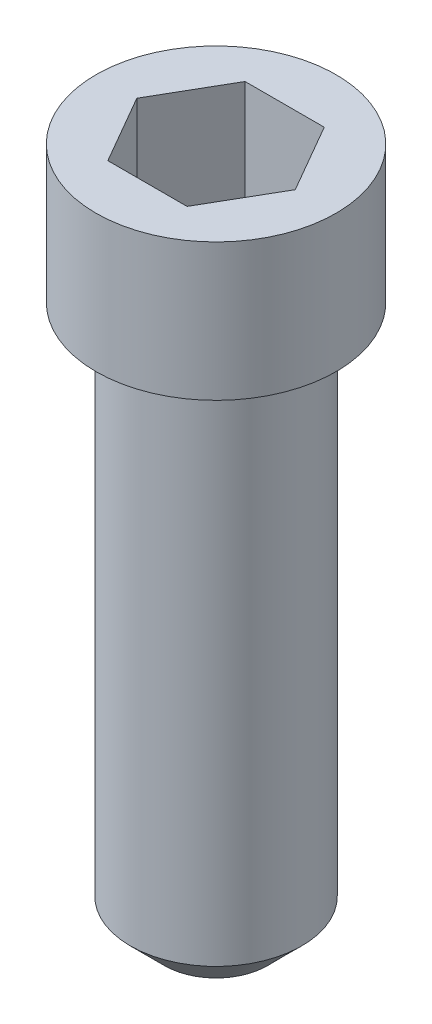
ISO-10303-21;
HEADER;
FILE_DESCRIPTION(('STEP AP214'),'2;1');
FILE_NAME('part.step','',(''),(''),'','','');
FILE_SCHEMA(('AUTOMOTIVE_DESIGN { 1 0 10303 214 1 1 1 1 }'));
ENDSEC;
DATA;
#1=APPLICATION_CONTEXT('core data for automotive mechanical design processes');
#2=APPLICATION_PROTOCOL_DEFINITION('international standard','automotive_design',2000,#1);
#3=PRODUCT_CONTEXT('',#1,'mechanical');
#4=PRODUCT('Part','Part','',(#3));
#5=PRODUCT_RELATED_PRODUCT_CATEGORY('part','',(#4));
#6=PRODUCT_DEFINITION_FORMATION('','',#4);
#7=PRODUCT_DEFINITION_CONTEXT('part definition',#1,'design');
#8=PRODUCT_DEFINITION('design','',#6,#7);
#9=PRODUCT_DEFINITION_SHAPE('','',#8);
#10=(LENGTH_UNIT() NAMED_UNIT(*) SI_UNIT(.MILLI.,.METRE.));
#11=(NAMED_UNIT(*) PLANE_ANGLE_UNIT() SI_UNIT($,.RADIAN.));
#12=(NAMED_UNIT(*) SI_UNIT($,.STERADIAN.) SOLID_ANGLE_UNIT());
#13=UNCERTAINTY_MEASURE_WITH_UNIT(LENGTH_MEASURE(1.E-05),#10,'distance_accuracy_value','');
#14=(GEOMETRIC_REPRESENTATION_CONTEXT(3) GLOBAL_UNCERTAINTY_ASSIGNED_CONTEXT((#13)) GLOBAL_UNIT_ASSIGNED_CONTEXT((#10,
#11,#12)) REPRESENTATION_CONTEXT('',''));
#15=CARTESIAN_POINT('',(0.,0.,0.));
#16=DIRECTION('',(0.,0.,1.));
#17=DIRECTION('',(1.,0.,0.));
#18=AXIS2_PLACEMENT_3D('',#15,#16,#17);
#19=CARTESIAN_POINT('',(0.,16.,0.));
#20=DIRECTION('',(0.,-1.,0.));
#21=DIRECTION('',(0.,0.,-1.));
#22=AXIS2_PLACEMENT_3D('',#19,#20,#21);
#23=CYLINDRICAL_SURFACE('',#22,2.5);
#24=CARTESIAN_POINT('',(0.,0.999999999999999,0.));
#25=DIRECTION('',(0.,1.,0.));
#26=DIRECTION('',(0.,0.,1.));
#27=AXIS2_PLACEMENT_3D('',#24,#25,#26);
#28=CIRCLE('',#27,2.5);
#29=CARTESIAN_POINT('',(0.,0.999999999999999,2.5));
#30=VERTEX_POINT('',#29);
#31=EDGE_CURVE('E39',#30,#30,#28,.T.);
#32=ORIENTED_EDGE('',*,*,#31,.T.);
#33=EDGE_LOOP('',(#32));
#34=FACE_BOUND('',#33,.T.);
#35=CARTESIAN_POINT('',(0.,16.,0.));
#36=DIRECTION('',(0.,1.,0.));
#37=DIRECTION('',(0.,0.,1.));
#38=AXIS2_PLACEMENT_3D('',#35,#36,#37);
#39=CIRCLE('',#38,2.5);
#40=CARTESIAN_POINT('',(0.,16.,2.5));
#41=VERTEX_POINT('',#40);
#42=EDGE_CURVE('E142',#41,#41,#39,.T.);
#43=ORIENTED_EDGE('',*,*,#42,.F.);
#44=EDGE_LOOP('',(#43));
#45=FACE_BOUND('',#44,.T.);
#46=ADVANCED_FACE('F31',(#34,#45),#23,.T.);
#47=CARTESIAN_POINT('',(0.,0.,0.));
#48=DIRECTION('',(0.,1.,0.));
#49=DIRECTION('',(0.,0.,1.));
#50=AXIS2_PLACEMENT_3D('',#47,#48,#49);
#51=PLANE('',#50);
#52=CARTESIAN_POINT('',(0.,0.,0.));
#53=DIRECTION('',(0.,1.,0.));
#54=DIRECTION('',(0.,0.,1.));
#55=AXIS2_PLACEMENT_3D('',#52,#53,#54);
#56=CIRCLE('',#55,1.5);
#57=CARTESIAN_POINT('',(0.,0.,1.5));
#58=VERTEX_POINT('',#57);
#59=EDGE_CURVE('E11',#58,#58,#56,.F.);
#60=ORIENTED_EDGE('',*,*,#59,.T.);
#61=EDGE_LOOP('',(#60));
#62=FACE_BOUND('',#61,.T.);
#63=ADVANCED_FACE('F166',(#62),#51,.F.);
#64=CARTESIAN_POINT('',(0.,16.,0.));
#65=DIRECTION('',(0.,1.,0.));
#66=DIRECTION('',(0.,0.,1.));
#67=AXIS2_PLACEMENT_3D('',#64,#65,#66);
#68=PLANE('',#67);
#69=CARTESIAN_POINT('',(0.,16.,0.));
#70=DIRECTION('',(0.,1.,0.));
#71=DIRECTION('',(0.,0.,1.));
#72=AXIS2_PLACEMENT_3D('',#69,#70,#71);
#73=CIRCLE('',#72,3.5);
#74=CARTESIAN_POINT('',(0.,16.,3.5));
#75=VERTEX_POINT('',#74);
#76=EDGE_CURVE('E133',#75,#75,#73,.T.);
#77=ORIENTED_EDGE('',*,*,#76,.F.);
#78=EDGE_LOOP('',(#77));
#79=FACE_BOUND('',#78,.T.);
#80=ORIENTED_EDGE('',*,*,#42,.T.);
#81=EDGE_LOOP('',(#80));
#82=FACE_BOUND('',#81,.T.);
#83=ADVANCED_FACE('F170',(#79,#82),#68,.F.);
#84=CARTESIAN_POINT('',(0.,20.,0.));
#85=DIRECTION('',(0.,-1.,0.));
#86=DIRECTION('',(0.,0.,-1.));
#87=AXIS2_PLACEMENT_3D('',#84,#85,#86);
#88=CYLINDRICAL_SURFACE('',#87,3.5);
#89=CARTESIAN_POINT('',(0.,20.,0.));
#90=DIRECTION('',(0.,1.,0.));
#91=DIRECTION('',(0.,0.,1.));
#92=AXIS2_PLACEMENT_3D('',#89,#90,#91);
#93=CIRCLE('',#92,3.5);
#94=CARTESIAN_POINT('',(0.,20.,3.5));
#95=VERTEX_POINT('',#94);
#96=EDGE_CURVE('E139',#95,#95,#93,.T.);
#97=ORIENTED_EDGE('',*,*,#96,.F.);
#98=EDGE_LOOP('',(#97));
#99=FACE_BOUND('',#98,.T.);
#100=ORIENTED_EDGE('',*,*,#76,.T.);
#101=EDGE_LOOP('',(#100));
#102=FACE_BOUND('',#101,.T.);
#103=ADVANCED_FACE('F161',(#99,#102),#88,.T.);
#104=CARTESIAN_POINT('',(0.,20.,0.));
#105=DIRECTION('',(0.,1.,0.));
#106=DIRECTION('',(0.,0.,1.));
#107=AXIS2_PLACEMENT_3D('',#104,#105,#106);
#108=PLANE('',#107);
#109=DIRECTION('',(0.5,0.,-0.866025403784438));
#110=VECTOR('',#109,1.);
#111=CARTESIAN_POINT('',(1.15470053837925,20.,2.));
#112=LINE('',#111,#110);
#113=CARTESIAN_POINT('',(1.15470053837925,20.,2.));
#114=VERTEX_POINT('',#113);
#115=CARTESIAN_POINT('',(2.3094010767585,20.,0.));
#116=VERTEX_POINT('',#115);
#117=EDGE_CURVE('E46',#114,#116,#112,.T.);
#118=ORIENTED_EDGE('',*,*,#117,.F.);
#119=DIRECTION('',(1.,0.,0.));
#120=VECTOR('',#119,1.);
#121=CARTESIAN_POINT('',(-1.15470053837925,20.,2.));
#122=LINE('',#121,#120);
#123=CARTESIAN_POINT('',(-1.15470053837925,20.,2.));
#124=VERTEX_POINT('',#123);
#125=EDGE_CURVE('E129',#124,#114,#122,.T.);
#126=ORIENTED_EDGE('',*,*,#125,.F.);
#127=DIRECTION('',(0.5,0.,0.866025403784439));
#128=VECTOR('',#127,1.);
#129=CARTESIAN_POINT('',(-2.3094010767585,20.,0.));
#130=LINE('',#129,#128);
#131=CARTESIAN_POINT('',(-2.3094010767585,20.,0.));
#132=VERTEX_POINT('',#131);
#133=EDGE_CURVE('E127',#132,#124,#130,.T.);
#134=ORIENTED_EDGE('',*,*,#133,.F.);
#135=DIRECTION('',(-0.5,0.,0.866025403784439));
#136=VECTOR('',#135,1.);
#137=CARTESIAN_POINT('',(-1.15470053837925,20.,-2.));
#138=LINE('',#137,#136);
#139=CARTESIAN_POINT('',(-1.15470053837925,20.,-2.));
#140=VERTEX_POINT('',#139);
#141=EDGE_CURVE('E94',#140,#132,#138,.T.);
#142=ORIENTED_EDGE('',*,*,#141,.F.);
#143=DIRECTION('',(-1.,0.,0.));
#144=VECTOR('',#143,1.);
#145=CARTESIAN_POINT('',(1.15470053837925,20.,-2.));
#146=LINE('',#145,#144);
#147=CARTESIAN_POINT('',(1.15470053837925,20.,-2.));
#148=VERTEX_POINT('',#147);
#149=EDGE_CURVE('E123',#148,#140,#146,.T.);
#150=ORIENTED_EDGE('',*,*,#149,.F.);
#151=DIRECTION('',(-0.5,0.,-0.866025403784438));
#152=VECTOR('',#151,1.);
#153=CARTESIAN_POINT('',(2.3094010767585,20.,0.));
#154=LINE('',#153,#152);
#155=EDGE_CURVE('E120',#116,#148,#154,.T.);
#156=ORIENTED_EDGE('',*,*,#155,.F.);
#157=EDGE_LOOP('',(#118,#126,#134,#142,#150,#156));
#158=FACE_BOUND('',#157,.T.);
#159=ORIENTED_EDGE('',*,*,#96,.T.);
#160=EDGE_LOOP('',(#159));
#161=FACE_BOUND('',#160,.T.);
#162=ADVANCED_FACE('F153',(#158,#161),#108,.T.);
#163=CARTESIAN_POINT('',(0.,0.999999999999999,0.));
#164=DIRECTION('',(0.,1.,0.));
#165=DIRECTION('',(0.,0.,1.));
#166=AXIS2_PLACEMENT_3D('',#163,#164,#165);
#167=CONICAL_SURFACE('',#166,2.5,0.78539816339745);
#168=ORIENTED_EDGE('',*,*,#59,.F.);
#169=EDGE_LOOP('',(#168));
#170=FACE_BOUND('',#169,.T.);
#171=ORIENTED_EDGE('',*,*,#31,.F.);
#172=EDGE_LOOP('',(#171));
#173=FACE_BOUND('',#172,.T.);
#174=ADVANCED_FACE('F33',(#170,#173),#167,.T.);
#175=CARTESIAN_POINT('',(1.15470053837925,17.,2.));
#176=DIRECTION('',(0.866025403784439,0.,0.5));
#177=DIRECTION('',(0.5,0.,-0.866025403784439));
#178=AXIS2_PLACEMENT_3D('',#175,#176,#177);
#179=PLANE('',#178);
#180=ORIENTED_EDGE('',*,*,#117,.T.);
#181=DIRECTION('',(0.,1.,0.));
#182=VECTOR('',#181,1.);
#183=CARTESIAN_POINT('',(2.3094010767585,17.,0.));
#184=LINE('',#183,#182);
#185=CARTESIAN_POINT('',(2.3094010767585,17.,0.));
#186=VERTEX_POINT('',#185);
#187=EDGE_CURVE('E76',#186,#116,#184,.T.);
#188=ORIENTED_EDGE('',*,*,#187,.F.);
#189=DIRECTION('',(0.5,0.,-0.866025403784438));
#190=VECTOR('',#189,1.);
#191=CARTESIAN_POINT('',(1.15470053837925,17.,2.));
#192=LINE('',#191,#190);
#193=CARTESIAN_POINT('',(1.15470053837925,17.,2.));
#194=VERTEX_POINT('',#193);
#195=EDGE_CURVE('E131',#194,#186,#192,.T.);
#196=ORIENTED_EDGE('',*,*,#195,.F.);
#197=DIRECTION('',(0.,1.,0.));
#198=VECTOR('',#197,1.);
#199=CARTESIAN_POINT('',(1.15470053837925,17.,2.));
#200=LINE('',#199,#198);
#201=EDGE_CURVE('E54',#194,#114,#200,.T.);
#202=ORIENTED_EDGE('',*,*,#201,.T.);
#203=EDGE_LOOP('',(#180,#188,#196,#202));
#204=FACE_BOUND('',#203,.T.);
#205=ADVANCED_FACE('F152',(#204),#179,.F.);
#206=CARTESIAN_POINT('',(-1.15470053837925,17.,2.));
#207=DIRECTION('',(0.,0.,1.));
#208=DIRECTION('',(1.,0.,0.));
#209=AXIS2_PLACEMENT_3D('',#206,#207,#208);
#210=PLANE('',#209);
#211=ORIENTED_EDGE('',*,*,#125,.T.);
#212=ORIENTED_EDGE('',*,*,#201,.F.);
#213=DIRECTION('',(1.,0.,0.));
#214=VECTOR('',#213,1.);
#215=CARTESIAN_POINT('',(-1.15470053837925,17.,2.));
#216=LINE('',#215,#214);
#217=CARTESIAN_POINT('',(-1.15470053837925,17.,2.));
#218=VERTEX_POINT('',#217);
#219=EDGE_CURVE('E106',#218,#194,#216,.T.);
#220=ORIENTED_EDGE('',*,*,#219,.F.);
#221=DIRECTION('',(0.,1.,0.));
#222=VECTOR('',#221,1.);
#223=CARTESIAN_POINT('',(-1.15470053837925,17.,2.));
#224=LINE('',#223,#222);
#225=EDGE_CURVE('E98',#218,#124,#224,.T.);
#226=ORIENTED_EDGE('',*,*,#225,.T.);
#227=EDGE_LOOP('',(#211,#212,#220,#226));
#228=FACE_BOUND('',#227,.T.);
#229=ADVANCED_FACE('F159',(#228),#210,.F.);
#230=CARTESIAN_POINT('',(-2.3094010767585,17.,0.));
#231=DIRECTION('',(-0.866025403784438,0.,0.5));
#232=DIRECTION('',(0.5,0.,0.866025403784439));
#233=AXIS2_PLACEMENT_3D('',#230,#231,#232);
#234=PLANE('',#233);
#235=ORIENTED_EDGE('',*,*,#133,.T.);
#236=ORIENTED_EDGE('',*,*,#225,.F.);
#237=DIRECTION('',(0.5,0.,0.866025403784439));
#238=VECTOR('',#237,1.);
#239=CARTESIAN_POINT('',(-2.3094010767585,17.,0.));
#240=LINE('',#239,#238);
#241=CARTESIAN_POINT('',(-2.3094010767585,17.,0.));
#242=VERTEX_POINT('',#241);
#243=EDGE_CURVE('E102',#242,#218,#240,.T.);
#244=ORIENTED_EDGE('',*,*,#243,.F.);
#245=DIRECTION('',(0.,1.,0.));
#246=VECTOR('',#245,1.);
#247=CARTESIAN_POINT('',(-2.3094010767585,17.,0.));
#248=LINE('',#247,#246);
#249=EDGE_CURVE('E87',#242,#132,#248,.T.);
#250=ORIENTED_EDGE('',*,*,#249,.T.);
#251=EDGE_LOOP('',(#235,#236,#244,#250));
#252=FACE_BOUND('',#251,.T.);
#253=ADVANCED_FACE('F103',(#252),#234,.F.);
#254=CARTESIAN_POINT('',(-1.15470053837925,17.,-2.));
#255=DIRECTION('',(-0.866025403784439,0.,-0.5));
#256=DIRECTION('',(-0.5,0.,0.866025403784439));
#257=AXIS2_PLACEMENT_3D('',#254,#255,#256);
#258=PLANE('',#257);
#259=ORIENTED_EDGE('',*,*,#141,.T.);
#260=ORIENTED_EDGE('',*,*,#249,.F.);
#261=DIRECTION('',(-0.5,0.,0.866025403784439));
#262=VECTOR('',#261,1.);
#263=CARTESIAN_POINT('',(-1.15470053837925,17.,-2.));
#264=LINE('',#263,#262);
#265=CARTESIAN_POINT('',(-1.15470053837925,17.,-2.));
#266=VERTEX_POINT('',#265);
#267=EDGE_CURVE('E91',#266,#242,#264,.T.);
#268=ORIENTED_EDGE('',*,*,#267,.F.);
#269=DIRECTION('',(0.,1.,0.));
#270=VECTOR('',#269,1.);
#271=CARTESIAN_POINT('',(-1.15470053837925,17.,-2.));
#272=LINE('',#271,#270);
#273=EDGE_CURVE('E99',#266,#140,#272,.T.);
#274=ORIENTED_EDGE('',*,*,#273,.T.);
#275=EDGE_LOOP('',(#259,#260,#268,#274));
#276=FACE_BOUND('',#275,.T.);
#277=ADVANCED_FACE('F89',(#276),#258,.F.);
#278=CARTESIAN_POINT('',(1.15470053837925,17.,-2.));
#279=DIRECTION('',(0.,0.,-1.));
#280=DIRECTION('',(-1.,0.,0.));
#281=AXIS2_PLACEMENT_3D('',#278,#279,#280);
#282=PLANE('',#281);
#283=ORIENTED_EDGE('',*,*,#149,.T.);
#284=ORIENTED_EDGE('',*,*,#273,.F.);
#285=DIRECTION('',(-1.,0.,0.));
#286=VECTOR('',#285,1.);
#287=CARTESIAN_POINT('',(1.15470053837925,17.,-2.));
#288=LINE('',#287,#286);
#289=CARTESIAN_POINT('',(1.15470053837925,17.,-2.));
#290=VERTEX_POINT('',#289);
#291=EDGE_CURVE('E112',#290,#266,#288,.T.);
#292=ORIENTED_EDGE('',*,*,#291,.F.);
#293=DIRECTION('',(0.,1.,0.));
#294=VECTOR('',#293,1.);
#295=CARTESIAN_POINT('',(1.15470053837925,17.,-2.));
#296=LINE('',#295,#294);
#297=EDGE_CURVE('E136',#290,#148,#296,.T.);
#298=ORIENTED_EDGE('',*,*,#297,.T.);
#299=EDGE_LOOP('',(#283,#284,#292,#298));
#300=FACE_BOUND('',#299,.T.);
#301=ADVANCED_FACE('F183',(#300),#282,.F.);
#302=CARTESIAN_POINT('',(2.3094010767585,17.,0.));
#303=DIRECTION('',(0.866025403784438,0.,-0.5));
#304=DIRECTION('',(-0.5,0.,-0.866025403784438));
#305=AXIS2_PLACEMENT_3D('',#302,#303,#304);
#306=PLANE('',#305);
#307=ORIENTED_EDGE('',*,*,#155,.T.);
#308=ORIENTED_EDGE('',*,*,#297,.F.);
#309=DIRECTION('',(-0.5,0.,-0.866025403784438));
#310=VECTOR('',#309,1.);
#311=CARTESIAN_POINT('',(2.3094010767585,17.,0.));
#312=LINE('',#311,#310);
#313=EDGE_CURVE('E114',#186,#290,#312,.T.);
#314=ORIENTED_EDGE('',*,*,#313,.F.);
#315=ORIENTED_EDGE('',*,*,#187,.T.);
#316=EDGE_LOOP('',(#307,#308,#314,#315));
#317=FACE_BOUND('',#316,.T.);
#318=ADVANCED_FACE('F180',(#317),#306,.F.);
#319=CARTESIAN_POINT('',(2.3094010767585,17.,0.));
#320=DIRECTION('',(0.,1.,0.));
#321=DIRECTION('',(0.,0.,1.));
#322=AXIS2_PLACEMENT_3D('',#319,#320,#321);
#323=PLANE('',#322);
#324=ORIENTED_EDGE('',*,*,#195,.T.);
#325=ORIENTED_EDGE('',*,*,#313,.T.);
#326=ORIENTED_EDGE('',*,*,#291,.T.);
#327=ORIENTED_EDGE('',*,*,#267,.T.);
#328=ORIENTED_EDGE('',*,*,#243,.T.);
#329=ORIENTED_EDGE('',*,*,#219,.T.);
#330=EDGE_LOOP('',(#324,#325,#326,#327,#328,#329));
#331=FACE_BOUND('',#330,.T.);
#332=ADVANCED_FACE('F109',(#331),#323,.T.);
#333=CLOSED_SHELL('',(#46,#63,#83,#103,#162,#174,#205,#229,#253,#277,#301,#318,#332));
#334=MANIFOLD_SOLID_BREP('B2',#333);
#335=ADVANCED_BREP_SHAPE_REPRESENTATION('',(#18,#334),#14);
#336=SHAPE_DEFINITION_REPRESENTATION(#9,#335);
ENDSEC;
END-ISO-10303-21;
